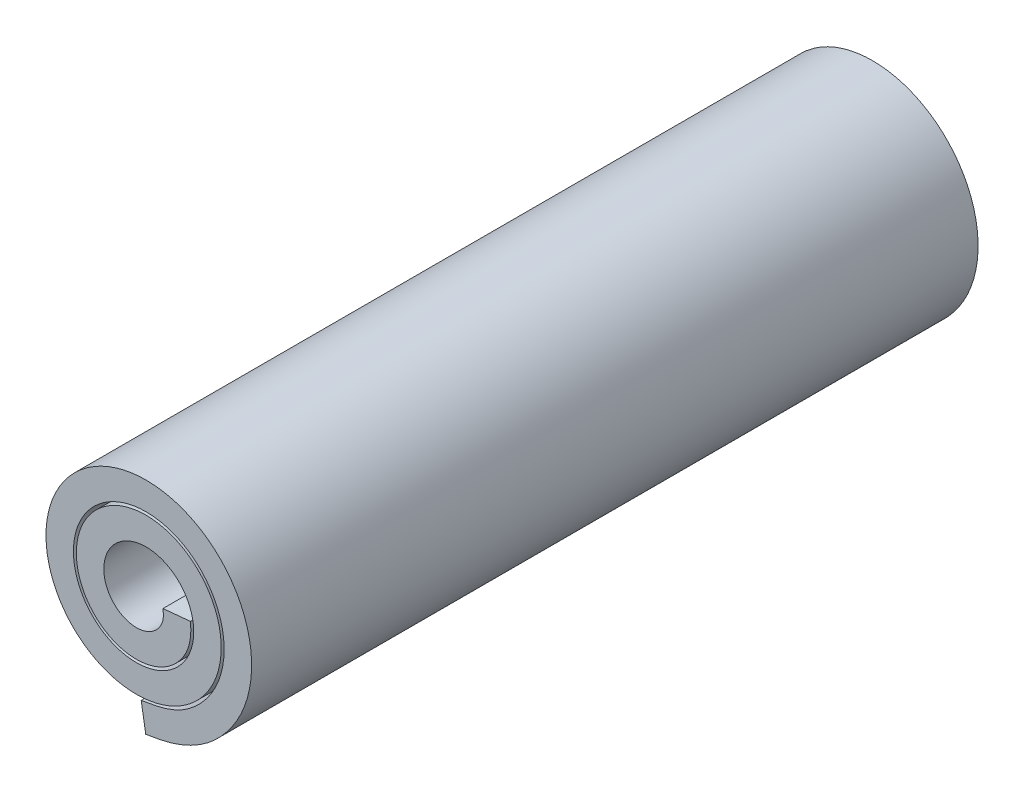
ISO-10303-21;
HEADER;
FILE_DESCRIPTION(('STEP AP214'),'2;1');
FILE_NAME('part.step','',(''),(''),'','','');
FILE_SCHEMA(('AUTOMOTIVE_DESIGN { 1 0 10303 214 1 1 1 1 }'));
ENDSEC;
DATA;
#1=APPLICATION_CONTEXT('core data for automotive mechanical design processes');
#2=APPLICATION_PROTOCOL_DEFINITION('international standard','automotive_design',2000,#1);
#3=PRODUCT_CONTEXT('',#1,'mechanical');
#4=PRODUCT('Part','Part','',(#3));
#5=PRODUCT_RELATED_PRODUCT_CATEGORY('part','',(#4));
#6=PRODUCT_DEFINITION_FORMATION('','',#4);
#7=PRODUCT_DEFINITION_CONTEXT('part definition',#1,'design');
#8=PRODUCT_DEFINITION('design','',#6,#7);
#9=PRODUCT_DEFINITION_SHAPE('','',#8);
#10=(LENGTH_UNIT() NAMED_UNIT(*) SI_UNIT(.MILLI.,.METRE.));
#11=(NAMED_UNIT(*) PLANE_ANGLE_UNIT() SI_UNIT($,.RADIAN.));
#12=(NAMED_UNIT(*) SI_UNIT($,.STERADIAN.) SOLID_ANGLE_UNIT());
#13=UNCERTAINTY_MEASURE_WITH_UNIT(LENGTH_MEASURE(1.E-05),#10,'distance_accuracy_value','');
#14=(GEOMETRIC_REPRESENTATION_CONTEXT(3) GLOBAL_UNCERTAINTY_ASSIGNED_CONTEXT((#13)) GLOBAL_UNIT_ASSIGNED_CONTEXT((#10,
#11,#12)) REPRESENTATION_CONTEXT('',''));
#15=CARTESIAN_POINT('',(0.,0.,0.));
#16=DIRECTION('',(0.,0.,1.));
#17=DIRECTION('',(1.,0.,0.));
#18=AXIS2_PLACEMENT_3D('',#15,#16,#17);
#19=CARTESIAN_POINT('',(0.299999999999993,0.,0.));
#20=DIRECTION('',(0.093792238504887,-0.995591791848568,0.));
#21=DIRECTION('',(0.995591791848568,0.093792238504887,0.));
#22=AXIS2_PLACEMENT_3D('',#19,#20,#21);
#23=PLANE('',#22);
#24=DIRECTION('',(-0.995591791848568,-0.093792238504887,0.));
#25=VECTOR('',#24,1.);
#26=CARTESIAN_POINT('',(0.676333697318752,0.0354534661548466,0.));
#27=LINE('',#26,#25);
#28=CARTESIAN_POINT('',(0.676333697318752,0.0354534661548466,0.));
#29=VERTEX_POINT('',#28);
#30=CARTESIAN_POINT('',(0.299999999999993,0.,0.));
#31=VERTEX_POINT('',#30);
#32=EDGE_CURVE('E76',#29,#31,#27,.T.);
#33=ORIENTED_EDGE('',*,*,#32,.F.);
#34=DIRECTION('',(0.,0.,1.));
#35=VECTOR('',#34,1.);
#36=CARTESIAN_POINT('',(0.676333697318754,0.0354534661548468,-10.));
#37=LINE('',#36,#35);
#38=CARTESIAN_POINT('',(0.676333697318754,0.0354534661548468,-10.));
#39=VERTEX_POINT('',#38);
#40=EDGE_CURVE('E102',#39,#29,#37,.T.);
#41=ORIENTED_EDGE('',*,*,#40,.F.);
#42=DIRECTION('',(0.995591791848568,0.093792238504887,0.));
#43=VECTOR('',#42,1.);
#44=CARTESIAN_POINT('',(0.299999999999994,0.,-10.));
#45=LINE('',#44,#43);
#46=CARTESIAN_POINT('',(0.299999999999994,0.,-10.));
#47=VERTEX_POINT('',#46);
#48=EDGE_CURVE('E77',#47,#39,#45,.T.);
#49=ORIENTED_EDGE('',*,*,#48,.F.);
#50=DIRECTION('',(0.,0.,-1.));
#51=VECTOR('',#50,1.);
#52=CARTESIAN_POINT('',(0.299999999999993,0.,0.));
#53=LINE('',#52,#51);
#54=EDGE_CURVE('E74',#31,#47,#53,.T.);
#55=ORIENTED_EDGE('',*,*,#54,.F.);
#56=EDGE_LOOP('',(#33,#41,#49,#55));
#57=FACE_BOUND('',#56,.T.);
#58=ADVANCED_FACE('F33',(#57),#23,.F.);
#59=CARTESIAN_POINT('',(0.,-1.245,0.));
#60=DIRECTION('',(-0.986101513551397,-0.166143928482637,0.));
#61=DIRECTION('',(0.166143928482637,-0.986101513551397,0.));
#62=AXIS2_PLACEMENT_3D('',#59,#60,#61);
#63=PLANE('',#62);
#64=DIRECTION('',(-0.166143928482637,0.986101513551397,0.));
#65=VECTOR('',#64,1.);
#66=CARTESIAN_POINT('',(0.0628024049663975,-1.61774637212243,0.));
#67=LINE('',#66,#65);
#68=CARTESIAN_POINT('',(0.0628024049663975,-1.61774637212243,0.));
#69=VERTEX_POINT('',#68);
#70=CARTESIAN_POINT('',(0.,-1.245,0.));
#71=VERTEX_POINT('',#70);
#72=EDGE_CURVE('E93',#69,#71,#67,.T.);
#73=ORIENTED_EDGE('',*,*,#72,.T.);
#74=DIRECTION('',(0.,0.,-1.));
#75=VECTOR('',#74,1.);
#76=CARTESIAN_POINT('',(0.,-1.245,0.));
#77=LINE('',#76,#75);
#78=CARTESIAN_POINT('',(0.,-1.245,-10.));
#79=VERTEX_POINT('',#78);
#80=EDGE_CURVE('E92',#71,#79,#77,.T.);
#81=ORIENTED_EDGE('',*,*,#80,.T.);
#82=DIRECTION('',(0.166143928482637,-0.986101513551397,0.));
#83=VECTOR('',#82,1.);
#84=CARTESIAN_POINT('',(0.,-1.245,-10.));
#85=LINE('',#84,#83);
#86=CARTESIAN_POINT('',(0.0628024049663979,-1.61774637212243,-10.));
#87=VERTEX_POINT('',#86);
#88=EDGE_CURVE('E41',#79,#87,#85,.T.);
#89=ORIENTED_EDGE('',*,*,#88,.T.);
#90=DIRECTION('',(0.,0.,1.));
#91=VECTOR('',#90,1.);
#92=CARTESIAN_POINT('',(0.0628024049663979,-1.61774637212243,-10.));
#93=LINE('',#92,#91);
#94=EDGE_CURVE('E11',#87,#69,#93,.T.);
#95=ORIENTED_EDGE('',*,*,#94,.T.);
#96=EDGE_LOOP('',(#73,#81,#89,#95));
#97=FACE_BOUND('',#96,.T.);
#98=ADVANCED_FACE('F124',(#97),#63,.T.);
#99=CARTESIAN_POINT('',(0.,-1.245,-10.));
#100=CARTESIAN_POINT('',(0.115187473739038,-1.22553273579025,-10.));
#101=CARTESIAN_POINT('',(0.353767971403374,-1.18521142799037,-10.));
#102=CARTESIAN_POINT('',(0.614241126051371,-1.05952400478144,-10.));
#103=CARTESIAN_POINT('',(0.817630252582043,-0.881628784923457,-10.));
#104=CARTESIAN_POINT('',(0.960687196190321,-0.700354913500336,-10.));
#105=CARTESIAN_POINT('',(1.06660529609601,-0.496897643389831,-10.));
#106=CARTESIAN_POINT('',(1.13012147991976,-0.276961173512591,-10.));
#107=CARTESIAN_POINT('',(1.14949613138239,-0.0477779051615201,-10.));
#108=CARTESIAN_POINT('',(1.12265138482121,0.180102285730291,-10.));
#109=CARTESIAN_POINT('',(1.05067919055026,0.398426906695811,-10.));
#110=CARTESIAN_POINT('',(0.935575942327866,0.597023354769019,-10.));
#111=CARTESIAN_POINT('',(0.784694985991668,0.765248158897865,-10.));
#112=CARTESIAN_POINT('',(0.605843391099269,0.896406695952585,-10.));
#113=CARTESIAN_POINT('',(0.407905341639855,0.9877819759404,-10.));
#114=CARTESIAN_POINT('',(0.195328003123231,1.03661307969812,-10.));
#115=CARTESIAN_POINT('',(-0.0225580566751957,1.04101207349019,-10.));
#116=CARTESIAN_POINT('',(-0.236887781640561,0.999389677871279,-10.));
#117=CARTESIAN_POINT('',(-0.437231703346516,0.913845314458887,-10.));
#118=CARTESIAN_POINT('',(-0.614993124585112,0.786712378367355,-10.));
#119=CARTESIAN_POINT('',(-0.760427111794022,0.624542302832159,-10.));
#120=CARTESIAN_POINT('',(-0.866865862292705,0.433563459307496,-10.));
#121=CARTESIAN_POINT('',(-0.927411674054384,0.224109797647406,-10.));
#122=CARTESIAN_POINT('',(-0.938973601104933,0.00594115346097706,-10.));
#123=CARTESIAN_POINT('',(-0.8993453136731,-0.208925218049516,-10.));
#124=CARTESIAN_POINT('',(-0.810609982931764,-0.408270030664899,-10.));
#125=CARTESIAN_POINT('',(-0.676219610276139,-0.580997823700486,-10.));
#126=CARTESIAN_POINT('',(-0.504050613636745,-0.715335301212992,-10.));
#127=CARTESIAN_POINT('',(-0.311170092736851,-0.799776552991447,-10.));
#128=CARTESIAN_POINT('',(-0.111759229428013,-0.833888051099701,-10.));
#129=CARTESIAN_POINT('',(0.0816767046063828,-0.821948995197773,-10.));
#130=CARTESIAN_POINT('',(0.267606563817247,-0.764877430301185,-10.));
#131=CARTESIAN_POINT('',(0.434093711748612,-0.665080582597662,-10.));
#132=CARTESIAN_POINT('',(0.571533663848642,-0.527938175007913,-10.));
#133=CARTESIAN_POINT('',(0.659584304092555,-0.378818584940153,-10.));
#134=CARTESIAN_POINT('',(0.706803889786265,-0.236540413963541,-10.));
#135=CARTESIAN_POINT('',(0.725601090189353,-0.108557978813464,-10.));
#136=CARTESIAN_POINT('',(0.721752710679401,0.020183353326502,-10.));
#137=CARTESIAN_POINT('',(0.694678727831053,0.146546340414252,-10.));
#138=CARTESIAN_POINT('',(0.645357366678239,0.26577014045339,-10.));
#139=CARTESIAN_POINT('',(0.574601691123212,0.373749583330161,-10.));
#140=CARTESIAN_POINT('',(0.484861993418268,0.466706925065545,-10.));
#141=CARTESIAN_POINT('',(0.378943558991331,0.540434064544937,-10.));
#142=CARTESIAN_POINT('',(0.260512946369325,0.592323564340288,-10.));
#143=CARTESIAN_POINT('',(0.134230133633623,0.619244824699268,-10.));
#144=CARTESIAN_POINT('',(0.00493895282966922,0.620098536418646,-10.));
#145=CARTESIAN_POINT('',(-0.121656969535435,0.593724110262598,-10.));
#146=CARTESIAN_POINT('',(-0.2396967405314,0.541232737936512,-10.));
#147=CARTESIAN_POINT('',(-0.343618941073419,0.463793484227292,-10.));
#148=CARTESIAN_POINT('',(-0.427328136234886,0.365510408122722,-10.));
#149=CARTESIAN_POINT('',(-0.486449299209828,0.249962740807124,-10.));
#150=CARTESIAN_POINT('',(-0.516339091340317,0.124184024540013,-10.));
#151=CARTESIAN_POINT('',(-0.514945396870169,0.00535149142242865,-10.));
#152=CARTESIAN_POINT('',(-0.489824932995394,-0.0991731517701299,-10.));
#153=CARTESIAN_POINT('',(-0.449488008872045,-0.187231812685129,-9.99999999999999));
#154=CARTESIAN_POINT('',(-0.392117079384167,-0.265470078439589,-10.));
#155=CARTESIAN_POINT('',(-0.320144400468735,-0.330269100858395,-10.));
#156=CARTESIAN_POINT('',(-0.235681624750264,-0.378379085855958,-10.));
#157=CARTESIAN_POINT('',(-0.14315732215158,-0.406899800598055,-10.));
#158=CARTESIAN_POINT('',(-0.0460085542767336,-0.413714644980703,-10.));
#159=CARTESIAN_POINT('',(0.0460242806043499,-0.398221708459915,-10.));
#160=CARTESIAN_POINT('',(0.12906640251427,-0.363299421900292,-10.));
#161=CARTESIAN_POINT('',(0.198135565310517,-0.313050155132907,-10.));
#162=CARTESIAN_POINT('',(0.255531284477437,-0.246665880980748,-10.));
#163=CARTESIAN_POINT('',(0.29515466243971,-0.166216430276865,-10.));
#164=CARTESIAN_POINT('',(0.308213268479196,-0.0982618677506787,-10.));
#165=CARTESIAN_POINT('',(0.302513516404801,-0.0300711972564496,-10.));
#166=CARTESIAN_POINT('',(0.299999999999994,0.,-10.));
#167=CARTESIAN_POINT('',(0.,-1.245,0.));
#168=CARTESIAN_POINT('',(0.115187473739038,-1.22553273579025,0.));
#169=CARTESIAN_POINT('',(0.353767971403373,-1.18521142799037,0.));
#170=CARTESIAN_POINT('',(0.614241126051371,-1.05952400478144,0.));
#171=CARTESIAN_POINT('',(0.817630252582042,-0.881628784923456,0.));
#172=CARTESIAN_POINT('',(0.96068719619032,-0.700354913500335,0.));
#173=CARTESIAN_POINT('',(1.06660529609601,-0.496897643389831,0.));
#174=CARTESIAN_POINT('',(1.13012147991976,-0.27696117351259,0.));
#175=CARTESIAN_POINT('',(1.14949613138239,-0.0477779051615201,0.));
#176=CARTESIAN_POINT('',(1.12265138482121,0.180102285730291,0.));
#177=CARTESIAN_POINT('',(1.05067919055026,0.39842690669581,0.));
#178=CARTESIAN_POINT('',(0.935575942327865,0.597023354769018,0.));
#179=CARTESIAN_POINT('',(0.784694985991667,0.765248158897864,0.));
#180=CARTESIAN_POINT('',(0.605843391099269,0.896406695952584,0.));
#181=CARTESIAN_POINT('',(0.407905341639855,0.987781975940398,0.));
#182=CARTESIAN_POINT('',(0.195328003123231,1.03661307969812,0.));
#183=CARTESIAN_POINT('',(-0.0225580566751956,1.04101207349019,0.));
#184=CARTESIAN_POINT('',(-0.23688778164056,0.999389677871278,0.));
#185=CARTESIAN_POINT('',(-0.437231703346515,0.913845314458886,0.));
#186=CARTESIAN_POINT('',(-0.61499312458511,0.786712378367354,0.));
#187=CARTESIAN_POINT('',(-0.760427111794021,0.624542302832158,0.));
#188=CARTESIAN_POINT('',(-0.866865862292703,0.433563459307495,0.));
#189=CARTESIAN_POINT('',(-0.927411674054383,0.224109797647406,0.));
#190=CARTESIAN_POINT('',(-0.938973601104932,0.0059411534609771,0.));
#191=CARTESIAN_POINT('',(-0.899345313673099,-0.208925218049516,0.));
#192=CARTESIAN_POINT('',(-0.810609982931763,-0.408270030664898,0.));
#193=CARTESIAN_POINT('',(-0.676219610276138,-0.580997823700485,0.));
#194=CARTESIAN_POINT('',(-0.504050613636745,-0.715335301212991,0.));
#195=CARTESIAN_POINT('',(-0.31117009273685,-0.799776552991445,0.));
#196=CARTESIAN_POINT('',(-0.111759229428013,-0.833888051099699,0.));
#197=CARTESIAN_POINT('',(0.0816767046063826,-0.821948995197772,0.));
#198=CARTESIAN_POINT('',(0.267606563817247,-0.764877430301184,0.));
#199=CARTESIAN_POINT('',(0.434093711748611,-0.665080582597661,0.));
#200=CARTESIAN_POINT('',(0.571533663848641,-0.527938175007912,0.));
#201=CARTESIAN_POINT('',(0.659584304092553,-0.378818584940153,0.));
#202=CARTESIAN_POINT('',(0.706803889786263,-0.236540413963541,0.));
#203=CARTESIAN_POINT('',(0.725601090189351,-0.108557978813464,0.));
#204=CARTESIAN_POINT('',(0.7217527106794,0.0201833533265018,0.));
#205=CARTESIAN_POINT('',(0.694678727831052,0.146546340414251,0.));
#206=CARTESIAN_POINT('',(0.645357366678238,0.265770140453389,0.));
#207=CARTESIAN_POINT('',(0.574601691123211,0.37374958333016,0.));
#208=CARTESIAN_POINT('',(0.484861993418267,0.466706925065544,0.));
#209=CARTESIAN_POINT('',(0.378943558991331,0.540434064544936,0.));
#210=CARTESIAN_POINT('',(0.260512946369324,0.592323564340287,0.));
#211=CARTESIAN_POINT('',(0.134230133633623,0.619244824699267,0.));
#212=CARTESIAN_POINT('',(0.0049389528296693,0.620098536418645,0.));
#213=CARTESIAN_POINT('',(-0.121656969535434,0.593724110262597,0.));
#214=CARTESIAN_POINT('',(-0.239696740531399,0.54123273793651,0.));
#215=CARTESIAN_POINT('',(-0.343618941073418,0.463793484227291,0.));
#216=CARTESIAN_POINT('',(-0.427328136234885,0.365510408122721,0.));
#217=CARTESIAN_POINT('',(-0.486449299209827,0.249962740807124,0.));
#218=CARTESIAN_POINT('',(-0.516339091340315,0.124184024540013,0.));
#219=CARTESIAN_POINT('',(-0.514945396870168,0.00535149142242879,0.));
#220=CARTESIAN_POINT('',(-0.489824932995393,-0.0991731517701295,0.));
#221=CARTESIAN_POINT('',(-0.449488008872044,-0.187231812685128,0.));
#222=CARTESIAN_POINT('',(-0.392117079384166,-0.265470078439589,0.));
#223=CARTESIAN_POINT('',(-0.320144400468734,-0.330269100858394,0.));
#224=CARTESIAN_POINT('',(-0.235681624750264,-0.378379085855957,0.));
#225=CARTESIAN_POINT('',(-0.14315732215158,-0.406899800598054,0.));
#226=CARTESIAN_POINT('',(-0.0460085542767337,-0.413714644980701,0.));
#227=CARTESIAN_POINT('',(0.0460242806043496,-0.398221708459914,0.));
#228=CARTESIAN_POINT('',(0.129066402514269,-0.36329942190029,0.));
#229=CARTESIAN_POINT('',(0.198135565310516,-0.313050155132906,0.));
#230=CARTESIAN_POINT('',(0.255531284477436,-0.246665880980748,0.));
#231=CARTESIAN_POINT('',(0.295154662439709,-0.166216430276865,0.));
#232=CARTESIAN_POINT('',(0.308213268479195,-0.0982618677506787,0.));
#233=CARTESIAN_POINT('',(0.302513516404799,-0.0300711972564497,0.));
#234=CARTESIAN_POINT('',(0.299999999999993,0.,0.));
#235=B_SPLINE_SURFACE_WITH_KNOTS('',1,3,((#99,#100,#101,#102,#103,#104,#105,#106,#107,#108,#109,
#110,#111,#112,#113,#114,#115,#116,#117,#118,#119,#120,#121,#122,#123,#124,#125,#126,#127,#128,
#129,#130,#131,#132,#133,#134,#135,#136,#137,#138,#139,#140,#141,#142,#143,#144,#145,#146,#147,
#148,#149,#150,#151,#152,#153,#154,#155,#156,#157,#158,#159,#160,#161,#162,#163,#164,#165,#166),
(#167,#168,#169,#170,#171,#172,#173,#174,#175,#176,#177,#178,#179,#180,#181,#182,#183,#184,#185,
#186,#187,#188,#189,#190,#191,#192,#193,#194,#195,#196,#197,#198,#199,#200,#201,#202,#203,#204,
#205,#206,#207,#208,#209,#210,#211,#212,#213,#214,#215,#216,#217,#218,#219,#220,#221,#222,#223,
#224,#225,#226,#227,#228,#229,#230,#231,#232,#233,#234)),.UNSPECIFIED.,.F.,.F.,.F.,(2,2),(4,1,1,
1,1,1,1,1,1,1,1,1,1,1,1,1,1,1,1,1,1,1,1,1,1,1,1,1,1,1,1,1,1,1,1,1,1,1,1,1,1,1,1,1,1,1,1,1,1,1,1,
1,1,1,1,1,1,1,1,1,1,1,1,1,1,4),(0.518211601464637,1.),(0.,0.0276569759900051,0.0572841376010446,
0.0770949744957776,0.0967597680103295,0.116415852282449,0.136148048198849,0.155909148840343,
0.175705715870727,0.195509397802656,0.215352550148175,0.235219213079137,0.25411394003553,
0.273033783418019,0.291983749686718,0.310967613632045,0.32997661067976,0.349029878285721,
0.368102917991533,0.387230030820004,0.406376032697236,0.425579888296524,0.444813728221295,
0.46409470411015,0.483429294655977,0.502795548731435,0.522230214549338,0.541713456634356,
0.559082357396023,0.576515108363194,0.593980454966658,0.611515722392399,0.629105647751169,
0.646745443333069,0.658575807940051,0.67041885404358,0.682308775655791,0.694223222117301,
0.706177566782932,0.718171192783669,0.730199913918088,0.74227871761855,0.754393863354549,
0.766565271773404,0.778780945688554,0.791054534540864,0.803388394676818,0.815776095406598,
0.828245582709591,0.840769254156807,0.853391352253893,0.86609111072931,0.875689655898569,
0.885348695848098,0.895070773671186,0.904865877022695,0.914729592397221,0.924686066490103,
0.93472054206472,0.944880728702389,0.953998873927047,0.963220386755095,0.97247748227852,
0.982095296293533,0.992104258939337,1.),.UNSPECIFIED.);
#236=CARTESIAN_POINT('',(0.,-1.245,0.));
#237=CARTESIAN_POINT('',(0.115187473739038,-1.22553273579025,0.));
#238=CARTESIAN_POINT('',(0.353767971403373,-1.18521142799037,0.));
#239=CARTESIAN_POINT('',(0.614241126051371,-1.05952400478144,0.));
#240=CARTESIAN_POINT('',(0.817630252582042,-0.881628784923456,0.));
#241=CARTESIAN_POINT('',(0.96068719619032,-0.700354913500335,0.));
#242=CARTESIAN_POINT('',(1.06660529609601,-0.496897643389831,0.));
#243=CARTESIAN_POINT('',(1.13012147991976,-0.27696117351259,0.));
#244=CARTESIAN_POINT('',(1.14949613138239,-0.0477779051615201,0.));
#245=CARTESIAN_POINT('',(1.12265138482121,0.180102285730291,0.));
#246=CARTESIAN_POINT('',(1.05067919055026,0.39842690669581,0.));
#247=CARTESIAN_POINT('',(0.935575942327865,0.597023354769018,0.));
#248=CARTESIAN_POINT('',(0.784694985991667,0.765248158897864,0.));
#249=CARTESIAN_POINT('',(0.605843391099269,0.896406695952584,0.));
#250=CARTESIAN_POINT('',(0.407905341639855,0.987781975940398,0.));
#251=CARTESIAN_POINT('',(0.195328003123231,1.03661307969812,0.));
#252=CARTESIAN_POINT('',(-0.0225580566751956,1.04101207349019,0.));
#253=CARTESIAN_POINT('',(-0.23688778164056,0.999389677871278,0.));
#254=CARTESIAN_POINT('',(-0.437231703346515,0.913845314458886,0.));
#255=CARTESIAN_POINT('',(-0.61499312458511,0.786712378367354,0.));
#256=CARTESIAN_POINT('',(-0.760427111794021,0.624542302832158,0.));
#257=CARTESIAN_POINT('',(-0.866865862292703,0.433563459307495,0.));
#258=CARTESIAN_POINT('',(-0.927411674054383,0.224109797647406,0.));
#259=CARTESIAN_POINT('',(-0.938973601104932,0.0059411534609771,0.));
#260=CARTESIAN_POINT('',(-0.899345313673099,-0.208925218049516,0.));
#261=CARTESIAN_POINT('',(-0.810609982931763,-0.408270030664898,0.));
#262=CARTESIAN_POINT('',(-0.676219610276138,-0.580997823700485,0.));
#263=CARTESIAN_POINT('',(-0.504050613636745,-0.715335301212991,0.));
#264=CARTESIAN_POINT('',(-0.31117009273685,-0.799776552991445,0.));
#265=CARTESIAN_POINT('',(-0.111759229428013,-0.833888051099699,0.));
#266=CARTESIAN_POINT('',(0.0816767046063826,-0.821948995197772,0.));
#267=CARTESIAN_POINT('',(0.267606563817247,-0.764877430301184,0.));
#268=CARTESIAN_POINT('',(0.434093711748611,-0.665080582597661,0.));
#269=CARTESIAN_POINT('',(0.571533663848641,-0.527938175007912,0.));
#270=CARTESIAN_POINT('',(0.659584304092553,-0.378818584940153,0.));
#271=CARTESIAN_POINT('',(0.706803889786263,-0.236540413963541,0.));
#272=CARTESIAN_POINT('',(0.725601090189351,-0.108557978813464,0.));
#273=CARTESIAN_POINT('',(0.7217527106794,0.0201833533265018,0.));
#274=CARTESIAN_POINT('',(0.694678727831052,0.146546340414251,0.));
#275=CARTESIAN_POINT('',(0.645357366678238,0.265770140453389,0.));
#276=CARTESIAN_POINT('',(0.574601691123211,0.37374958333016,0.));
#277=CARTESIAN_POINT('',(0.484861993418267,0.466706925065544,0.));
#278=CARTESIAN_POINT('',(0.378943558991331,0.540434064544936,0.));
#279=CARTESIAN_POINT('',(0.260512946369324,0.592323564340287,0.));
#280=CARTESIAN_POINT('',(0.134230133633623,0.619244824699267,0.));
#281=CARTESIAN_POINT('',(0.0049389528296693,0.620098536418645,0.));
#282=CARTESIAN_POINT('',(-0.121656969535434,0.593724110262597,0.));
#283=CARTESIAN_POINT('',(-0.239696740531399,0.54123273793651,0.));
#284=CARTESIAN_POINT('',(-0.343618941073418,0.463793484227291,0.));
#285=CARTESIAN_POINT('',(-0.427328136234885,0.365510408122721,0.));
#286=CARTESIAN_POINT('',(-0.486449299209827,0.249962740807124,0.));
#287=CARTESIAN_POINT('',(-0.516339091340315,0.124184024540013,0.));
#288=CARTESIAN_POINT('',(-0.514945396870168,0.00535149142242879,0.));
#289=CARTESIAN_POINT('',(-0.489824932995393,-0.0991731517701295,0.));
#290=CARTESIAN_POINT('',(-0.449488008872044,-0.187231812685128,0.));
#291=CARTESIAN_POINT('',(-0.392117079384166,-0.265470078439589,0.));
#292=CARTESIAN_POINT('',(-0.320144400468734,-0.330269100858394,0.));
#293=CARTESIAN_POINT('',(-0.235681624750264,-0.378379085855957,0.));
#294=CARTESIAN_POINT('',(-0.14315732215158,-0.406899800598054,0.));
#295=CARTESIAN_POINT('',(-0.0460085542767337,-0.413714644980701,0.));
#296=CARTESIAN_POINT('',(0.0460242806043496,-0.398221708459914,0.));
#297=CARTESIAN_POINT('',(0.129066402514269,-0.36329942190029,0.));
#298=CARTESIAN_POINT('',(0.198135565310516,-0.313050155132906,0.));
#299=CARTESIAN_POINT('',(0.255531284477436,-0.246665880980748,0.));
#300=CARTESIAN_POINT('',(0.295154662439709,-0.166216430276865,0.));
#301=CARTESIAN_POINT('',(0.308213268479195,-0.0982618677506787,0.));
#302=CARTESIAN_POINT('',(0.302513516404799,-0.0300711972564497,0.));
#303=CARTESIAN_POINT('',(0.299999999999993,0.,0.));
#304=B_SPLINE_CURVE_WITH_KNOTS('',3,(#236,#237,#238,#239,#240,#241,#242,#243,#244,#245,#246,
#247,#248,#249,#250,#251,#252,#253,#254,#255,#256,#257,#258,#259,#260,#261,#262,#263,#264,#265,
#266,#267,#268,#269,#270,#271,#272,#273,#274,#275,#276,#277,#278,#279,#280,#281,#282,#283,#284,
#285,#286,#287,#288,#289,#290,#291,#292,#293,#294,#295,#296,#297,#298,#299,#300,#301,#302,#303),
.UNSPECIFIED.,.F.,.F.,(4,1,1,1,1,1,1,1,1,1,1,1,1,1,1,1,1,1,1,1,1,1,1,1,1,1,1,1,1,1,1,1,1,1,1,1,
1,1,1,1,1,1,1,1,1,1,1,1,1,1,1,1,1,1,1,1,1,1,1,1,1,1,1,1,1,4),(0.,0.0276569759900051,
0.0572841376010446,0.0770949744957776,0.0967597680103295,0.116415852282449,0.136148048198849,
0.155909148840343,0.175705715870727,0.195509397802656,0.215352550148175,0.235219213079137,
0.25411394003553,0.273033783418019,0.291983749686718,0.310967613632045,0.32997661067976,
0.349029878285721,0.368102917991533,0.387230030820004,0.406376032697236,0.425579888296524,
0.444813728221295,0.46409470411015,0.483429294655977,0.502795548731435,0.522230214549338,
0.541713456634356,0.559082357396023,0.576515108363194,0.593980454966658,0.611515722392399,
0.629105647751169,0.646745443333069,0.658575807940051,0.67041885404358,0.682308775655791,
0.694223222117301,0.706177566782932,0.718171192783669,0.730199913918088,0.74227871761855,
0.754393863354549,0.766565271773404,0.778780945688554,0.791054534540864,0.803388394676818,
0.815776095406598,0.828245582709591,0.840769254156807,0.853391352253893,0.86609111072931,
0.875689655898569,0.885348695848098,0.895070773671186,0.904865877022695,0.914729592397221,
0.924686066490103,0.93472054206472,0.944880728702389,0.953998873927047,0.963220386755095,
0.97247748227852,0.982095296293533,0.992104258939337,1.),.UNSPECIFIED.);
#305=EDGE_CURVE('E85',#71,#31,#304,.T.);
#306=CARTESIAN_POINT('',(0.,-1.245,-10.));
#307=CARTESIAN_POINT('',(0.115187473739038,-1.22553273579025,-10.));
#308=CARTESIAN_POINT('',(0.353767971403374,-1.18521142799037,-10.));
#309=CARTESIAN_POINT('',(0.614241126051371,-1.05952400478144,-10.));
#310=CARTESIAN_POINT('',(0.817630252582043,-0.881628784923457,-10.));
#311=CARTESIAN_POINT('',(0.960687196190321,-0.700354913500336,-10.));
#312=CARTESIAN_POINT('',(1.06660529609601,-0.496897643389831,-10.));
#313=CARTESIAN_POINT('',(1.13012147991976,-0.276961173512591,-10.));
#314=CARTESIAN_POINT('',(1.14949613138239,-0.0477779051615201,-10.));
#315=CARTESIAN_POINT('',(1.12265138482121,0.180102285730291,-10.));
#316=CARTESIAN_POINT('',(1.05067919055026,0.398426906695811,-10.));
#317=CARTESIAN_POINT('',(0.935575942327866,0.597023354769019,-10.));
#318=CARTESIAN_POINT('',(0.784694985991668,0.765248158897865,-10.));
#319=CARTESIAN_POINT('',(0.605843391099269,0.896406695952585,-10.));
#320=CARTESIAN_POINT('',(0.407905341639855,0.9877819759404,-10.));
#321=CARTESIAN_POINT('',(0.195328003123231,1.03661307969812,-10.));
#322=CARTESIAN_POINT('',(-0.0225580566751957,1.04101207349019,-10.));
#323=CARTESIAN_POINT('',(-0.236887781640561,0.999389677871279,-10.));
#324=CARTESIAN_POINT('',(-0.437231703346516,0.913845314458887,-10.));
#325=CARTESIAN_POINT('',(-0.614993124585112,0.786712378367355,-10.));
#326=CARTESIAN_POINT('',(-0.760427111794022,0.624542302832159,-10.));
#327=CARTESIAN_POINT('',(-0.866865862292705,0.433563459307496,-10.));
#328=CARTESIAN_POINT('',(-0.927411674054384,0.224109797647406,-10.));
#329=CARTESIAN_POINT('',(-0.938973601104933,0.00594115346097706,-10.));
#330=CARTESIAN_POINT('',(-0.8993453136731,-0.208925218049516,-10.));
#331=CARTESIAN_POINT('',(-0.810609982931764,-0.408270030664899,-10.));
#332=CARTESIAN_POINT('',(-0.676219610276139,-0.580997823700486,-10.));
#333=CARTESIAN_POINT('',(-0.504050613636745,-0.715335301212992,-10.));
#334=CARTESIAN_POINT('',(-0.311170092736851,-0.799776552991447,-10.));
#335=CARTESIAN_POINT('',(-0.111759229428013,-0.833888051099701,-10.));
#336=CARTESIAN_POINT('',(0.0816767046063828,-0.821948995197773,-10.));
#337=CARTESIAN_POINT('',(0.267606563817247,-0.764877430301185,-10.));
#338=CARTESIAN_POINT('',(0.434093711748612,-0.665080582597662,-10.));
#339=CARTESIAN_POINT('',(0.571533663848642,-0.527938175007913,-10.));
#340=CARTESIAN_POINT('',(0.659584304092555,-0.378818584940153,-10.));
#341=CARTESIAN_POINT('',(0.706803889786265,-0.236540413963541,-10.));
#342=CARTESIAN_POINT('',(0.725601090189353,-0.108557978813464,-10.));
#343=CARTESIAN_POINT('',(0.721752710679401,0.020183353326502,-10.));
#344=CARTESIAN_POINT('',(0.694678727831053,0.146546340414252,-10.));
#345=CARTESIAN_POINT('',(0.645357366678239,0.26577014045339,-10.));
#346=CARTESIAN_POINT('',(0.574601691123212,0.373749583330161,-10.));
#347=CARTESIAN_POINT('',(0.484861993418268,0.466706925065545,-10.));
#348=CARTESIAN_POINT('',(0.378943558991331,0.540434064544937,-10.));
#349=CARTESIAN_POINT('',(0.260512946369325,0.592323564340288,-10.));
#350=CARTESIAN_POINT('',(0.134230133633623,0.619244824699268,-10.));
#351=CARTESIAN_POINT('',(0.00493895282966922,0.620098536418646,-10.));
#352=CARTESIAN_POINT('',(-0.121656969535435,0.593724110262598,-10.));
#353=CARTESIAN_POINT('',(-0.2396967405314,0.541232737936512,-10.));
#354=CARTESIAN_POINT('',(-0.343618941073419,0.463793484227292,-10.));
#355=CARTESIAN_POINT('',(-0.427328136234886,0.365510408122722,-10.));
#356=CARTESIAN_POINT('',(-0.486449299209828,0.249962740807124,-10.));
#357=CARTESIAN_POINT('',(-0.516339091340317,0.124184024540013,-10.));
#358=CARTESIAN_POINT('',(-0.514945396870169,0.00535149142242865,-10.));
#359=CARTESIAN_POINT('',(-0.489824932995394,-0.0991731517701299,-10.));
#360=CARTESIAN_POINT('',(-0.449488008872045,-0.187231812685129,-9.99999999999999));
#361=CARTESIAN_POINT('',(-0.392117079384167,-0.265470078439589,-10.));
#362=CARTESIAN_POINT('',(-0.320144400468735,-0.330269100858395,-10.));
#363=CARTESIAN_POINT('',(-0.235681624750264,-0.378379085855958,-10.));
#364=CARTESIAN_POINT('',(-0.14315732215158,-0.406899800598055,-10.));
#365=CARTESIAN_POINT('',(-0.0460085542767336,-0.413714644980703,-10.));
#366=CARTESIAN_POINT('',(0.0460242806043499,-0.398221708459915,-10.));
#367=CARTESIAN_POINT('',(0.12906640251427,-0.363299421900292,-10.));
#368=CARTESIAN_POINT('',(0.198135565310517,-0.313050155132907,-10.));
#369=CARTESIAN_POINT('',(0.255531284477437,-0.246665880980748,-10.));
#370=CARTESIAN_POINT('',(0.29515466243971,-0.166216430276865,-10.));
#371=CARTESIAN_POINT('',(0.308213268479196,-0.0982618677506787,-10.));
#372=CARTESIAN_POINT('',(0.302513516404801,-0.0300711972564496,-10.));
#373=CARTESIAN_POINT('',(0.299999999999994,0.,-10.));
#374=B_SPLINE_CURVE_WITH_KNOTS('',3,(#306,#307,#308,#309,#310,#311,#312,#313,#314,#315,#316,
#317,#318,#319,#320,#321,#322,#323,#324,#325,#326,#327,#328,#329,#330,#331,#332,#333,#334,#335,
#336,#337,#338,#339,#340,#341,#342,#343,#344,#345,#346,#347,#348,#349,#350,#351,#352,#353,#354,
#355,#356,#357,#358,#359,#360,#361,#362,#363,#364,#365,#366,#367,#368,#369,#370,#371,#372,#373),
.UNSPECIFIED.,.F.,.F.,(4,1,1,1,1,1,1,1,1,1,1,1,1,1,1,1,1,1,1,1,1,1,1,1,1,1,1,1,1,1,1,1,1,1,1,1,
1,1,1,1,1,1,1,1,1,1,1,1,1,1,1,1,1,1,1,1,1,1,1,1,1,1,1,1,1,4),(0.,0.0276569759900051,
0.0572841376010446,0.0770949744957776,0.0967597680103295,0.116415852282449,0.136148048198849,
0.155909148840343,0.175705715870727,0.195509397802656,0.215352550148175,0.235219213079137,
0.25411394003553,0.273033783418019,0.291983749686718,0.310967613632045,0.32997661067976,
0.349029878285721,0.368102917991533,0.387230030820004,0.406376032697236,0.425579888296524,
0.444813728221295,0.46409470411015,0.483429294655977,0.502795548731435,0.522230214549338,
0.541713456634356,0.559082357396023,0.576515108363194,0.593980454966658,0.611515722392399,
0.629105647751169,0.646745443333069,0.658575807940051,0.67041885404358,0.682308775655791,
0.694223222117301,0.706177566782932,0.718171192783669,0.730199913918088,0.74227871761855,
0.754393863354549,0.766565271773404,0.778780945688554,0.791054534540864,0.803388394676818,
0.815776095406598,0.828245582709591,0.840769254156807,0.853391352253893,0.86609111072931,
0.875689655898569,0.885348695848098,0.895070773671186,0.904865877022695,0.914729592397221,
0.924686066490103,0.93472054206472,0.944880728702389,0.953998873927047,0.963220386755095,
0.97247748227852,0.982095296293533,0.992104258939337,1.),.UNSPECIFIED.);
#375=EDGE_CURVE('E94',#79,#47,#374,.T.);
#376=ORIENTED_EDGE('',*,*,#80,.F.);
#377=ORIENTED_EDGE('',*,*,#305,.T.);
#378=ORIENTED_EDGE('',*,*,#54,.T.);
#379=ORIENTED_EDGE('',*,*,#375,.F.);
#380=EDGE_LOOP('',(#376,#377,#378,#379));
#381=FACE_BOUND('',#380,.T.);
#382=ADVANCED_FACE('F90',(#381),#235,.T.);
#383=CARTESIAN_POINT('',(0.0628024049663979,-1.61774637212243,-10.));
#384=DIRECTION('',(0.,0.,-1.));
#385=DIRECTION('',(-0.166143928482637,0.986101513551397,0.));
#386=AXIS2_PLACEMENT_3D('',#383,#384,#385);
#387=PLANE('',#386);
#388=ORIENTED_EDGE('',*,*,#88,.F.);
#389=ORIENTED_EDGE('',*,*,#375,.T.);
#390=ORIENTED_EDGE('',*,*,#48,.T.);
#391=CARTESIAN_POINT('',(0.0628024049663979,-1.61774637212243,-10.));
#392=CARTESIAN_POINT('',(0.187861625482086,-1.59768060420443,-10.));
#393=CARTESIAN_POINT('',(0.446888845192909,-1.5561196536905,-10.));
#394=CARTESIAN_POINT('',(0.829816495308046,-1.37699971334373,-10.));
#395=CARTESIAN_POINT('',(1.09267906941473,-1.14326161467393,-10.));
#396=CARTESIAN_POINT('',(1.2796928534111,-0.907517110457654,-10.));
#397=CARTESIAN_POINT('',(1.41966085612142,-0.638687863526546,-10.));
#398=CARTESIAN_POINT('',(1.50433543680077,-0.345795010049844,-10.));
#399=CARTESIAN_POINT('',(1.52997033890628,-0.0420279474985143,-10.));
#400=CARTESIAN_POINT('',(1.49424915222701,0.262440129040783,-10.));
#401=CARTESIAN_POINT('',(1.39811439495225,0.553933024147223,-10.));
#402=CARTESIAN_POINT('',(1.24364966767101,0.820748077198471,-10.));
#403=CARTESIAN_POINT('',(1.04072752548447,1.04692107229594,-10.));
#404=CARTESIAN_POINT('',(0.799234211780413,1.22420834181386,-10.));
#405=CARTESIAN_POINT('',(0.531052973657249,1.34794715320201,-10.));
#406=CARTESIAN_POINT('',(0.242329913294464,1.41443923175701,-10.));
#407=CARTESIAN_POINT('',(-0.0552555162513326,1.42038384417144,-10.));
#408=CARTESIAN_POINT('',(-0.348130566291362,1.36367405674499,-10.));
#409=CARTESIAN_POINT('',(-0.624143438990476,1.24578210916369,-10.));
#410=CARTESIAN_POINT('',(-0.868680091140088,1.0710391376918,-10.));
#411=CARTESIAN_POINT('',(-1.07085399968057,0.845687592401751,-10.));
#412=CARTESIAN_POINT('',(-1.2184702862604,0.580869178081962,-10.));
#413=CARTESIAN_POINT('',(-1.30347958001138,0.287543420064227,-10.));
#414=CARTESIAN_POINT('',(-1.31960501643617,-0.0184448222528376,-10.));
#415=CARTESIAN_POINT('',(-1.26400454791111,-0.321415303238009,-10.));
#416=CARTESIAN_POINT('',(-1.13788470384776,-0.604689527013847,-10.));
#417=CARTESIAN_POINT('',(-0.946916289858574,-0.850266609616133,-10.));
#418=CARTESIAN_POINT('',(-0.699861756629567,-1.04339603279376,-10.));
#419=CARTESIAN_POINT('',(-0.421529028027029,-1.16513444693756,-10.));
#420=CARTESIAN_POINT('',(-0.133007706990721,-1.21471558504834,-10.));
#421=CARTESIAN_POINT('',(0.150082799560217,-1.19730762776898,-10.));
#422=CARTESIAN_POINT('',(0.422198143844971,-1.11380311130196,-10.));
#423=CARTESIAN_POINT('',(0.66866966439202,-0.966437551078121,-10.));
#424=CARTESIAN_POINT('',(0.873272085733257,-0.762114976615114,-10.));
#425=CARTESIAN_POINT('',(1.00495321010318,-0.539630478968359,-10.));
#426=CARTESIAN_POINT('',(1.07647424017543,-0.324149926333049,-10.));
#427=CARTESIAN_POINT('',(1.10490198631751,-0.13101731017566,-10.));
#428=CARTESIAN_POINT('',(1.09904784320858,0.0659087819131013,-10.));
#429=CARTESIAN_POINT('',(1.05769926604692,0.259179414626416,-10.));
#430=CARTESIAN_POINT('',(0.981597134994292,0.443243627619813,-10.));
#431=CARTESIAN_POINT('',(0.871838604127064,0.610908987982763,-10.));
#432=CARTESIAN_POINT('',(0.731783622545182,0.756026767642458,-10.));
#433=CARTESIAN_POINT('',(0.564965569674301,0.872303928290932,-10.));
#434=CARTESIAN_POINT('',(0.377537664982559,0.954432929723311,-10.));
#435=CARTESIAN_POINT('',(0.175593622960164,0.997667848990886,-10.));
#436=CARTESIAN_POINT('',(-0.0325156436031572,0.999022468794095,-10.));
#437=CARTESIAN_POINT('',(-0.238157354219443,0.956417990103502,-10.));
#438=CARTESIAN_POINT('',(-0.432063410836612,0.870157266937584,-10.));
#439=CARTESIAN_POINT('',(-0.603744515775257,0.742510519367201,-10.));
#440=CARTESIAN_POINT('',(-0.744458025068109,0.57741122022975,-10.));
#441=CARTESIAN_POINT('',(-0.844184730036987,0.38276065583679,-10.));
#442=CARTESIAN_POINT('',(-0.895850260869247,0.166698570896628,-10.));
#443=CARTESIAN_POINT('',(-0.893432991156633,-0.0394474975177314,-10.));
#444=CARTESIAN_POINT('',(-0.84952147522112,-0.223034932285333,-10.));
#445=CARTESIAN_POINT('',(-0.777752392572812,-0.379744774390614,-10.));
#446=CARTESIAN_POINT('',(-0.674814480854385,-0.520478338648179,-10.));
#447=CARTESIAN_POINT('',(-0.543277970945517,-0.638926285305256,-10.));
#448=CARTESIAN_POINT('',(-0.387689267859341,-0.727828800064823,-10.));
#449=CARTESIAN_POINT('',(-0.21324752002257,-0.781680017814504,-10.));
#450=CARTESIAN_POINT('',(-0.0285381785565808,-0.794862873285026,-10.));
#451=CARTESIAN_POINT('',(0.151309727990936,-0.764808558203161,-10.));
#452=CARTESIAN_POINT('',(0.315196723535386,-0.696068424786803,-10.));
#453=CARTESIAN_POINT('',(0.457173758934823,-0.593402764394511,-10.));
#454=CARTESIAN_POINT('',(0.571778613971136,-0.458698235914533,-10.));
#455=CARTESIAN_POINT('',(0.657879160581823,-0.296384083200703,-10.));
#456=CARTESIAN_POINT('',(0.689570096226319,-0.0974325523075689,-10.));
#457=CARTESIAN_POINT('',(0.680384448353982,-0.00521380147685208,-10.));
#458=CARTESIAN_POINT('',(0.676333697318754,0.0354534661548469,-10.));
#459=B_SPLINE_CURVE_WITH_KNOTS('',3,(#391,#392,#393,#394,#395,#396,#397,#398,#399,#400,#401,
#402,#403,#404,#405,#406,#407,#408,#409,#410,#411,#412,#413,#414,#415,#416,#417,#418,#419,#420,
#421,#422,#423,#424,#425,#426,#427,#428,#429,#430,#431,#432,#433,#434,#435,#436,#437,#438,#439,
#440,#441,#442,#443,#444,#445,#446,#447,#448,#449,#450,#451,#452,#453,#454,#455,#456,#457,#458),
.UNSPECIFIED.,.F.,.F.,(4,1,1,1,1,1,1,1,1,1,1,1,1,1,1,1,1,1,1,1,1,1,1,1,1,1,1,1,1,1,1,1,1,1,1,1,
1,1,1,1,1,1,1,1,1,1,1,1,1,1,1,1,1,1,1,1,1,1,1,1,1,1,1,1,1,4),(0.,0.0276569759900051,
0.0572841376010446,0.0770949744957776,0.0967597680103295,0.116415852282449,0.136148048198849,
0.155909148840343,0.175705715870727,0.195509397802656,0.215352550148175,0.235219213079137,
0.25411394003553,0.273033783418019,0.291983749686718,0.310967613632045,0.32997661067976,
0.349029878285721,0.368102917991533,0.387230030820004,0.406376032697236,0.425579888296524,
0.444813728221295,0.46409470411015,0.483429294655977,0.502795548731435,0.522230214549338,
0.541713456634356,0.559082357396023,0.576515108363194,0.593980454966658,0.611515722392399,
0.629105647751169,0.646745443333069,0.658575807940051,0.67041885404358,0.682308775655791,
0.694223222117301,0.706177566782932,0.718171192783669,0.730199913918088,0.74227871761855,
0.754393863354549,0.766565271773404,0.778780945688554,0.791054534540864,0.803388394676818,
0.815776095406598,0.828245582709591,0.840769254156807,0.853391352253893,0.86609111072931,
0.875689655898569,0.885348695848098,0.895070773671186,0.904865877022695,0.914729592397221,
0.924686066490103,0.93472054206472,0.944880728702389,0.953998873927047,0.963220386755095,
0.97247748227852,0.982095296293533,0.992104258939337,1.),.UNSPECIFIED.);
#460=EDGE_CURVE('E54',#87,#39,#459,.T.);
#461=ORIENTED_EDGE('',*,*,#460,.F.);
#462=EDGE_LOOP('',(#388,#389,#390,#461));
#463=FACE_BOUND('',#462,.T.);
#464=ADVANCED_FACE('F125',(#463),#387,.T.);
#465=CARTESIAN_POINT('',(0.0628024049663975,-1.61774637212243,0.));
#466=CARTESIAN_POINT('',(0.187861625482085,-1.59768060420442,0.));
#467=CARTESIAN_POINT('',(0.446888845192909,-1.5561196536905,0.));
#468=CARTESIAN_POINT('',(0.829816495308045,-1.37699971334373,0.));
#469=CARTESIAN_POINT('',(1.09267906941473,-1.14326161467393,0.));
#470=CARTESIAN_POINT('',(1.2796928534111,-0.907517110457652,0.));
#471=CARTESIAN_POINT('',(1.41966085612142,-0.638687863526545,0.));
#472=CARTESIAN_POINT('',(1.50433543680077,-0.345795010049844,0.));
#473=CARTESIAN_POINT('',(1.52997033890628,-0.0420279474985144,0.));
#474=CARTESIAN_POINT('',(1.49424915222701,0.262440129040782,0.));
#475=CARTESIAN_POINT('',(1.39811439495224,0.553933024147222,0.));
#476=CARTESIAN_POINT('',(1.24364966767101,0.820748077198469,0.));
#477=CARTESIAN_POINT('',(1.04072752548447,1.04692107229594,0.));
#478=CARTESIAN_POINT('',(0.799234211780412,1.22420834181385,0.));
#479=CARTESIAN_POINT('',(0.531052973657248,1.347947153202,0.));
#480=CARTESIAN_POINT('',(0.242329913294464,1.414439231757,0.));
#481=CARTESIAN_POINT('',(-0.0552555162513325,1.42038384417144,0.));
#482=CARTESIAN_POINT('',(-0.348130566291362,1.36367405674499,0.));
#483=CARTESIAN_POINT('',(-0.624143438990474,1.24578210916369,0.));
#484=CARTESIAN_POINT('',(-0.868680091140086,1.07103913769179,0.));
#485=CARTESIAN_POINT('',(-1.07085399968056,0.845687592401749,0.));
#486=CARTESIAN_POINT('',(-1.2184702862604,0.580869178081961,0.));
#487=CARTESIAN_POINT('',(-1.30347958001138,0.287543420064226,0.));
#488=CARTESIAN_POINT('',(-1.31960501643617,-0.0184448222528374,0.));
#489=CARTESIAN_POINT('',(-1.2640045479111,-0.321415303238008,0.));
#490=CARTESIAN_POINT('',(-1.13788470384776,-0.604689527013845,0.));
#491=CARTESIAN_POINT('',(-0.946916289858572,-0.850266609616131,0.));
#492=CARTESIAN_POINT('',(-0.699861756629566,-1.04339603279376,0.));
#493=CARTESIAN_POINT('',(-0.421529028027029,-1.16513444693756,0.));
#494=CARTESIAN_POINT('',(-0.133007706990721,-1.21471558504834,0.));
#495=CARTESIAN_POINT('',(0.150082799560217,-1.19730762776897,0.));
#496=CARTESIAN_POINT('',(0.42219814384497,-1.11380311130195,0.));
#497=CARTESIAN_POINT('',(0.668669664392019,-0.96643755107812,0.));
#498=CARTESIAN_POINT('',(0.873272085733255,-0.762114976615112,0.));
#499=CARTESIAN_POINT('',(1.00495321010318,-0.539630478968358,0.));
#500=CARTESIAN_POINT('',(1.07647424017543,-0.324149926333048,0.));
#501=CARTESIAN_POINT('',(1.1049019863175,-0.13101731017566,0.));
#502=CARTESIAN_POINT('',(1.09904784320858,0.065908781913101,0.));
#503=CARTESIAN_POINT('',(1.05769926604692,0.259179414626415,0.));
#504=CARTESIAN_POINT('',(0.981597134994289,0.443243627619812,0.));
#505=CARTESIAN_POINT('',(0.871838604127062,0.610908987982761,0.));
#506=CARTESIAN_POINT('',(0.73178362254518,0.756026767642456,0.));
#507=CARTESIAN_POINT('',(0.5649655696743,0.87230392829093,0.));
#508=CARTESIAN_POINT('',(0.377537664982558,0.954432929723308,0.));
#509=CARTESIAN_POINT('',(0.175593622960164,0.997667848990885,0.));
#510=CARTESIAN_POINT('',(-0.0325156436031569,0.999022468794091,0.));
#511=CARTESIAN_POINT('',(-0.238157354219442,0.9564179901035,0.));
#512=CARTESIAN_POINT('',(-0.43206341083661,0.870157266937582,0.));
#513=CARTESIAN_POINT('',(-0.603744515775255,0.742510519367199,0.));
#514=CARTESIAN_POINT('',(-0.744458025068108,0.577411220229749,0.));
#515=CARTESIAN_POINT('',(-0.844184730036985,0.382760655836789,0.));
#516=CARTESIAN_POINT('',(-0.895850260869244,0.166698570896628,0.));
#517=CARTESIAN_POINT('',(-0.893432991156631,-0.0394474975177311,0.));
#518=CARTESIAN_POINT('',(-0.849521475221118,-0.223034932285332,0.));
#519=CARTESIAN_POINT('',(-0.777752392572811,-0.379744774390612,0.));
#520=CARTESIAN_POINT('',(-0.674814480854384,-0.520478338648177,0.));
#521=CARTESIAN_POINT('',(-0.543277970945516,-0.638926285305254,0.));
#522=CARTESIAN_POINT('',(-0.38768926785934,-0.727828800064821,0.));
#523=CARTESIAN_POINT('',(-0.213247520022569,-0.781680017814502,0.));
#524=CARTESIAN_POINT('',(-0.0285381785565808,-0.794862873285024,0.));
#525=CARTESIAN_POINT('',(0.151309727990936,-0.764808558203159,0.));
#526=CARTESIAN_POINT('',(0.315196723535385,-0.696068424786801,0.));
#527=CARTESIAN_POINT('',(0.457173758934822,-0.59340276439451,0.));
#528=CARTESIAN_POINT('',(0.571778613971134,-0.458698235914531,0.));
#529=CARTESIAN_POINT('',(0.65787916058182,-0.296384083200703,0.));
#530=CARTESIAN_POINT('',(0.689570096226317,-0.0974325523075688,0.));
#531=CARTESIAN_POINT('',(0.680384448353979,-0.00521380147685222,0.));
#532=CARTESIAN_POINT('',(0.676333697318752,0.0354534661548466,0.));
#533=CARTESIAN_POINT('',(0.0628024049663979,-1.61774637212243,-10.));
#534=CARTESIAN_POINT('',(0.187861625482086,-1.59768060420443,-10.));
#535=CARTESIAN_POINT('',(0.446888845192909,-1.5561196536905,-10.));
#536=CARTESIAN_POINT('',(0.829816495308046,-1.37699971334373,-10.));
#537=CARTESIAN_POINT('',(1.09267906941473,-1.14326161467393,-10.));
#538=CARTESIAN_POINT('',(1.2796928534111,-0.907517110457654,-10.));
#539=CARTESIAN_POINT('',(1.41966085612142,-0.638687863526546,-10.));
#540=CARTESIAN_POINT('',(1.50433543680077,-0.345795010049844,-10.));
#541=CARTESIAN_POINT('',(1.52997033890628,-0.0420279474985143,-10.));
#542=CARTESIAN_POINT('',(1.49424915222701,0.262440129040783,-10.));
#543=CARTESIAN_POINT('',(1.39811439495225,0.553933024147223,-10.));
#544=CARTESIAN_POINT('',(1.24364966767101,0.820748077198471,-10.));
#545=CARTESIAN_POINT('',(1.04072752548447,1.04692107229594,-10.));
#546=CARTESIAN_POINT('',(0.799234211780413,1.22420834181386,-10.));
#547=CARTESIAN_POINT('',(0.531052973657249,1.34794715320201,-10.));
#548=CARTESIAN_POINT('',(0.242329913294464,1.41443923175701,-10.));
#549=CARTESIAN_POINT('',(-0.0552555162513326,1.42038384417144,-10.));
#550=CARTESIAN_POINT('',(-0.348130566291362,1.36367405674499,-10.));
#551=CARTESIAN_POINT('',(-0.624143438990476,1.24578210916369,-10.));
#552=CARTESIAN_POINT('',(-0.868680091140088,1.0710391376918,-10.));
#553=CARTESIAN_POINT('',(-1.07085399968057,0.845687592401751,-10.));
#554=CARTESIAN_POINT('',(-1.2184702862604,0.580869178081962,-10.));
#555=CARTESIAN_POINT('',(-1.30347958001138,0.287543420064227,-10.));
#556=CARTESIAN_POINT('',(-1.31960501643617,-0.0184448222528376,-10.));
#557=CARTESIAN_POINT('',(-1.26400454791111,-0.321415303238009,-10.));
#558=CARTESIAN_POINT('',(-1.13788470384776,-0.604689527013847,-10.));
#559=CARTESIAN_POINT('',(-0.946916289858574,-0.850266609616133,-10.));
#560=CARTESIAN_POINT('',(-0.699861756629567,-1.04339603279376,-10.));
#561=CARTESIAN_POINT('',(-0.421529028027029,-1.16513444693756,-10.));
#562=CARTESIAN_POINT('',(-0.133007706990721,-1.21471558504834,-10.));
#563=CARTESIAN_POINT('',(0.150082799560217,-1.19730762776898,-10.));
#564=CARTESIAN_POINT('',(0.422198143844971,-1.11380311130196,-10.));
#565=CARTESIAN_POINT('',(0.66866966439202,-0.966437551078121,-10.));
#566=CARTESIAN_POINT('',(0.873272085733257,-0.762114976615114,-10.));
#567=CARTESIAN_POINT('',(1.00495321010318,-0.539630478968359,-10.));
#568=CARTESIAN_POINT('',(1.07647424017543,-0.324149926333049,-10.));
#569=CARTESIAN_POINT('',(1.10490198631751,-0.13101731017566,-10.));
#570=CARTESIAN_POINT('',(1.09904784320858,0.0659087819131013,-10.));
#571=CARTESIAN_POINT('',(1.05769926604692,0.259179414626416,-10.));
#572=CARTESIAN_POINT('',(0.981597134994292,0.443243627619813,-10.));
#573=CARTESIAN_POINT('',(0.871838604127064,0.610908987982763,-10.));
#574=CARTESIAN_POINT('',(0.731783622545182,0.756026767642458,-10.));
#575=CARTESIAN_POINT('',(0.564965569674301,0.872303928290932,-10.));
#576=CARTESIAN_POINT('',(0.377537664982559,0.954432929723311,-10.));
#577=CARTESIAN_POINT('',(0.175593622960164,0.997667848990886,-10.));
#578=CARTESIAN_POINT('',(-0.0325156436031572,0.999022468794095,-10.));
#579=CARTESIAN_POINT('',(-0.238157354219443,0.956417990103502,-10.));
#580=CARTESIAN_POINT('',(-0.432063410836612,0.870157266937584,-10.));
#581=CARTESIAN_POINT('',(-0.603744515775257,0.742510519367201,-10.));
#582=CARTESIAN_POINT('',(-0.744458025068109,0.57741122022975,-10.));
#583=CARTESIAN_POINT('',(-0.844184730036987,0.38276065583679,-10.));
#584=CARTESIAN_POINT('',(-0.895850260869247,0.166698570896628,-10.));
#585=CARTESIAN_POINT('',(-0.893432991156633,-0.0394474975177314,-10.));
#586=CARTESIAN_POINT('',(-0.84952147522112,-0.223034932285333,-10.));
#587=CARTESIAN_POINT('',(-0.777752392572812,-0.379744774390614,-10.));
#588=CARTESIAN_POINT('',(-0.674814480854385,-0.520478338648179,-10.));
#589=CARTESIAN_POINT('',(-0.543277970945517,-0.638926285305256,-10.));
#590=CARTESIAN_POINT('',(-0.387689267859341,-0.727828800064823,-10.));
#591=CARTESIAN_POINT('',(-0.21324752002257,-0.781680017814504,-10.));
#592=CARTESIAN_POINT('',(-0.0285381785565808,-0.794862873285026,-10.));
#593=CARTESIAN_POINT('',(0.151309727990936,-0.764808558203161,-10.));
#594=CARTESIAN_POINT('',(0.315196723535386,-0.696068424786803,-10.));
#595=CARTESIAN_POINT('',(0.457173758934823,-0.593402764394511,-10.));
#596=CARTESIAN_POINT('',(0.571778613971136,-0.458698235914533,-10.));
#597=CARTESIAN_POINT('',(0.657879160581823,-0.296384083200703,-10.));
#598=CARTESIAN_POINT('',(0.689570096226319,-0.0974325523075689,-10.));
#599=CARTESIAN_POINT('',(0.680384448353982,-0.00521380147685208,-10.));
#600=CARTESIAN_POINT('',(0.676333697318754,0.0354534661548469,-10.));
#601=B_SPLINE_SURFACE_WITH_KNOTS('',1,3,((#465,#466,#467,#468,#469,#470,#471,#472,#473,#474,
#475,#476,#477,#478,#479,#480,#481,#482,#483,#484,#485,#486,#487,#488,#489,#490,#491,#492,#493,
#494,#495,#496,#497,#498,#499,#500,#501,#502,#503,#504,#505,#506,#507,#508,#509,#510,#511,#512,
#513,#514,#515,#516,#517,#518,#519,#520,#521,#522,#523,#524,#525,#526,#527,#528,#529,#530,#531,
#532),(#533,#534,#535,#536,#537,#538,#539,#540,#541,#542,#543,#544,#545,#546,#547,#548,#549,
#550,#551,#552,#553,#554,#555,#556,#557,#558,#559,#560,#561,#562,#563,#564,#565,#566,#567,#568,
#569,#570,#571,#572,#573,#574,#575,#576,#577,#578,#579,#580,#581,#582,#583,#584,#585,#586,#587,
#588,#589,#590,#591,#592,#593,#594,#595,#596,#597,#598,#599,#600)),.UNSPECIFIED.,.F.,.F.,.F.,(2,
2),(4,1,1,1,1,1,1,1,1,1,1,1,1,1,1,1,1,1,1,1,1,1,1,1,1,1,1,1,1,1,1,1,1,1,1,1,1,1,1,1,1,1,1,1,1,1,
1,1,1,1,1,1,1,1,1,1,1,1,1,1,1,1,1,1,1,4),(0.0182116014646367,0.5),(0.,0.0276569759900051,
0.0572841376010446,0.0770949744957776,0.0967597680103295,0.116415852282449,0.136148048198849,
0.155909148840343,0.175705715870727,0.195509397802656,0.215352550148175,0.235219213079137,
0.25411394003553,0.273033783418019,0.291983749686718,0.310967613632045,0.32997661067976,
0.349029878285721,0.368102917991533,0.387230030820004,0.406376032697236,0.425579888296524,
0.444813728221295,0.46409470411015,0.483429294655977,0.502795548731435,0.522230214549338,
0.541713456634356,0.559082357396023,0.576515108363194,0.593980454966658,0.611515722392399,
0.629105647751169,0.646745443333069,0.658575807940051,0.67041885404358,0.682308775655791,
0.694223222117301,0.706177566782932,0.718171192783669,0.730199913918088,0.74227871761855,
0.754393863354549,0.766565271773404,0.778780945688554,0.791054534540864,0.803388394676818,
0.815776095406598,0.828245582709591,0.840769254156807,0.853391352253893,0.86609111072931,
0.875689655898569,0.885348695848098,0.895070773671186,0.904865877022695,0.914729592397221,
0.924686066490103,0.93472054206472,0.944880728702389,0.953998873927047,0.963220386755095,
0.97247748227852,0.982095296293533,0.992104258939337,1.),.UNSPECIFIED.);
#602=CARTESIAN_POINT('',(0.0628024049663975,-1.61774637212243,0.));
#603=CARTESIAN_POINT('',(0.187861625482085,-1.59768060420442,0.));
#604=CARTESIAN_POINT('',(0.446888845192909,-1.5561196536905,0.));
#605=CARTESIAN_POINT('',(0.829816495308045,-1.37699971334373,0.));
#606=CARTESIAN_POINT('',(1.09267906941473,-1.14326161467393,0.));
#607=CARTESIAN_POINT('',(1.2796928534111,-0.907517110457652,0.));
#608=CARTESIAN_POINT('',(1.41966085612142,-0.638687863526545,0.));
#609=CARTESIAN_POINT('',(1.50433543680077,-0.345795010049844,0.));
#610=CARTESIAN_POINT('',(1.52997033890628,-0.0420279474985144,0.));
#611=CARTESIAN_POINT('',(1.49424915222701,0.262440129040782,0.));
#612=CARTESIAN_POINT('',(1.39811439495224,0.553933024147222,0.));
#613=CARTESIAN_POINT('',(1.24364966767101,0.820748077198469,0.));
#614=CARTESIAN_POINT('',(1.04072752548447,1.04692107229594,0.));
#615=CARTESIAN_POINT('',(0.799234211780412,1.22420834181385,0.));
#616=CARTESIAN_POINT('',(0.531052973657248,1.347947153202,0.));
#617=CARTESIAN_POINT('',(0.242329913294464,1.414439231757,0.));
#618=CARTESIAN_POINT('',(-0.0552555162513325,1.42038384417144,0.));
#619=CARTESIAN_POINT('',(-0.348130566291362,1.36367405674499,0.));
#620=CARTESIAN_POINT('',(-0.624143438990474,1.24578210916369,0.));
#621=CARTESIAN_POINT('',(-0.868680091140086,1.07103913769179,0.));
#622=CARTESIAN_POINT('',(-1.07085399968056,0.845687592401749,0.));
#623=CARTESIAN_POINT('',(-1.2184702862604,0.580869178081961,0.));
#624=CARTESIAN_POINT('',(-1.30347958001138,0.287543420064226,0.));
#625=CARTESIAN_POINT('',(-1.31960501643617,-0.0184448222528374,0.));
#626=CARTESIAN_POINT('',(-1.2640045479111,-0.321415303238008,0.));
#627=CARTESIAN_POINT('',(-1.13788470384776,-0.604689527013845,0.));
#628=CARTESIAN_POINT('',(-0.946916289858572,-0.850266609616131,0.));
#629=CARTESIAN_POINT('',(-0.699861756629566,-1.04339603279376,0.));
#630=CARTESIAN_POINT('',(-0.421529028027029,-1.16513444693756,0.));
#631=CARTESIAN_POINT('',(-0.133007706990721,-1.21471558504834,0.));
#632=CARTESIAN_POINT('',(0.150082799560217,-1.19730762776897,0.));
#633=CARTESIAN_POINT('',(0.42219814384497,-1.11380311130195,0.));
#634=CARTESIAN_POINT('',(0.668669664392019,-0.96643755107812,0.));
#635=CARTESIAN_POINT('',(0.873272085733255,-0.762114976615112,0.));
#636=CARTESIAN_POINT('',(1.00495321010318,-0.539630478968358,0.));
#637=CARTESIAN_POINT('',(1.07647424017543,-0.324149926333048,0.));
#638=CARTESIAN_POINT('',(1.1049019863175,-0.13101731017566,0.));
#639=CARTESIAN_POINT('',(1.09904784320858,0.065908781913101,0.));
#640=CARTESIAN_POINT('',(1.05769926604692,0.259179414626415,0.));
#641=CARTESIAN_POINT('',(0.981597134994289,0.443243627619812,0.));
#642=CARTESIAN_POINT('',(0.871838604127062,0.610908987982761,0.));
#643=CARTESIAN_POINT('',(0.73178362254518,0.756026767642456,0.));
#644=CARTESIAN_POINT('',(0.5649655696743,0.87230392829093,0.));
#645=CARTESIAN_POINT('',(0.377537664982558,0.954432929723308,0.));
#646=CARTESIAN_POINT('',(0.175593622960164,0.997667848990885,0.));
#647=CARTESIAN_POINT('',(-0.0325156436031569,0.999022468794091,0.));
#648=CARTESIAN_POINT('',(-0.238157354219442,0.9564179901035,0.));
#649=CARTESIAN_POINT('',(-0.43206341083661,0.870157266937582,0.));
#650=CARTESIAN_POINT('',(-0.603744515775255,0.742510519367199,0.));
#651=CARTESIAN_POINT('',(-0.744458025068108,0.577411220229749,0.));
#652=CARTESIAN_POINT('',(-0.844184730036985,0.382760655836789,0.));
#653=CARTESIAN_POINT('',(-0.895850260869244,0.166698570896628,0.));
#654=CARTESIAN_POINT('',(-0.893432991156631,-0.0394474975177311,0.));
#655=CARTESIAN_POINT('',(-0.849521475221118,-0.223034932285332,0.));
#656=CARTESIAN_POINT('',(-0.777752392572811,-0.379744774390612,0.));
#657=CARTESIAN_POINT('',(-0.674814480854384,-0.520478338648177,0.));
#658=CARTESIAN_POINT('',(-0.543277970945516,-0.638926285305254,0.));
#659=CARTESIAN_POINT('',(-0.38768926785934,-0.727828800064821,0.));
#660=CARTESIAN_POINT('',(-0.213247520022569,-0.781680017814502,0.));
#661=CARTESIAN_POINT('',(-0.0285381785565808,-0.794862873285024,0.));
#662=CARTESIAN_POINT('',(0.151309727990936,-0.764808558203159,0.));
#663=CARTESIAN_POINT('',(0.315196723535385,-0.696068424786801,0.));
#664=CARTESIAN_POINT('',(0.457173758934822,-0.59340276439451,0.));
#665=CARTESIAN_POINT('',(0.571778613971134,-0.458698235914531,0.));
#666=CARTESIAN_POINT('',(0.65787916058182,-0.296384083200703,0.));
#667=CARTESIAN_POINT('',(0.689570096226317,-0.0974325523075688,0.));
#668=CARTESIAN_POINT('',(0.680384448353979,-0.00521380147685222,0.));
#669=CARTESIAN_POINT('',(0.676333697318752,0.0354534661548466,0.));
#670=B_SPLINE_CURVE_WITH_KNOTS('',3,(#602,#603,#604,#605,#606,#607,#608,#609,#610,#611,#612,
#613,#614,#615,#616,#617,#618,#619,#620,#621,#622,#623,#624,#625,#626,#627,#628,#629,#630,#631,
#632,#633,#634,#635,#636,#637,#638,#639,#640,#641,#642,#643,#644,#645,#646,#647,#648,#649,#650,
#651,#652,#653,#654,#655,#656,#657,#658,#659,#660,#661,#662,#663,#664,#665,#666,#667,#668,#669),
.UNSPECIFIED.,.F.,.F.,(4,1,1,1,1,1,1,1,1,1,1,1,1,1,1,1,1,1,1,1,1,1,1,1,1,1,1,1,1,1,1,1,1,1,1,1,
1,1,1,1,1,1,1,1,1,1,1,1,1,1,1,1,1,1,1,1,1,1,1,1,1,1,1,1,1,4),(0.,0.0276569759900051,
0.0572841376010446,0.0770949744957776,0.0967597680103295,0.116415852282449,0.136148048198849,
0.155909148840343,0.175705715870727,0.195509397802656,0.215352550148175,0.235219213079137,
0.25411394003553,0.273033783418019,0.291983749686718,0.310967613632045,0.32997661067976,
0.349029878285721,0.368102917991533,0.387230030820004,0.406376032697236,0.425579888296524,
0.444813728221295,0.46409470411015,0.483429294655977,0.502795548731435,0.522230214549338,
0.541713456634356,0.559082357396023,0.576515108363194,0.593980454966658,0.611515722392399,
0.629105647751169,0.646745443333069,0.658575807940051,0.67041885404358,0.682308775655791,
0.694223222117301,0.706177566782932,0.718171192783669,0.730199913918088,0.74227871761855,
0.754393863354549,0.766565271773404,0.778780945688554,0.791054534540864,0.803388394676818,
0.815776095406598,0.828245582709591,0.840769254156807,0.853391352253893,0.86609111072931,
0.875689655898569,0.885348695848098,0.895070773671186,0.904865877022695,0.914729592397221,
0.924686066490103,0.93472054206472,0.944880728702389,0.953998873927047,0.963220386755095,
0.97247748227852,0.982095296293533,0.992104258939337,1.),.UNSPECIFIED.);
#671=EDGE_CURVE('E87',#69,#29,#670,.T.);
#672=ORIENTED_EDGE('',*,*,#94,.F.);
#673=ORIENTED_EDGE('',*,*,#460,.T.);
#674=ORIENTED_EDGE('',*,*,#40,.T.);
#675=ORIENTED_EDGE('',*,*,#671,.F.);
#676=EDGE_LOOP('',(#672,#673,#674,#675));
#677=FACE_BOUND('',#676,.T.);
#678=ADVANCED_FACE('F127',(#677),#601,.T.);
#679=CARTESIAN_POINT('',(0.,-1.245,0.));
#680=DIRECTION('',(0.,0.,1.));
#681=DIRECTION('',(0.166143928482637,-0.986101513551397,0.));
#682=AXIS2_PLACEMENT_3D('',#679,#680,#681);
#683=PLANE('',#682);
#684=ORIENTED_EDGE('',*,*,#72,.F.);
#685=ORIENTED_EDGE('',*,*,#671,.T.);
#686=ORIENTED_EDGE('',*,*,#32,.T.);
#687=ORIENTED_EDGE('',*,*,#305,.F.);
#688=EDGE_LOOP('',(#684,#685,#686,#687));
#689=FACE_BOUND('',#688,.T.);
#690=ADVANCED_FACE('F35',(#689),#683,.T.);
#691=CLOSED_SHELL('',(#58,#98,#382,#464,#678,#690));
#692=MANIFOLD_SOLID_BREP('B2',#691);
#693=ADVANCED_BREP_SHAPE_REPRESENTATION('',(#18,#692),#14);
#694=SHAPE_DEFINITION_REPRESENTATION(#9,#693);
ENDSEC;
END-ISO-10303-21;
